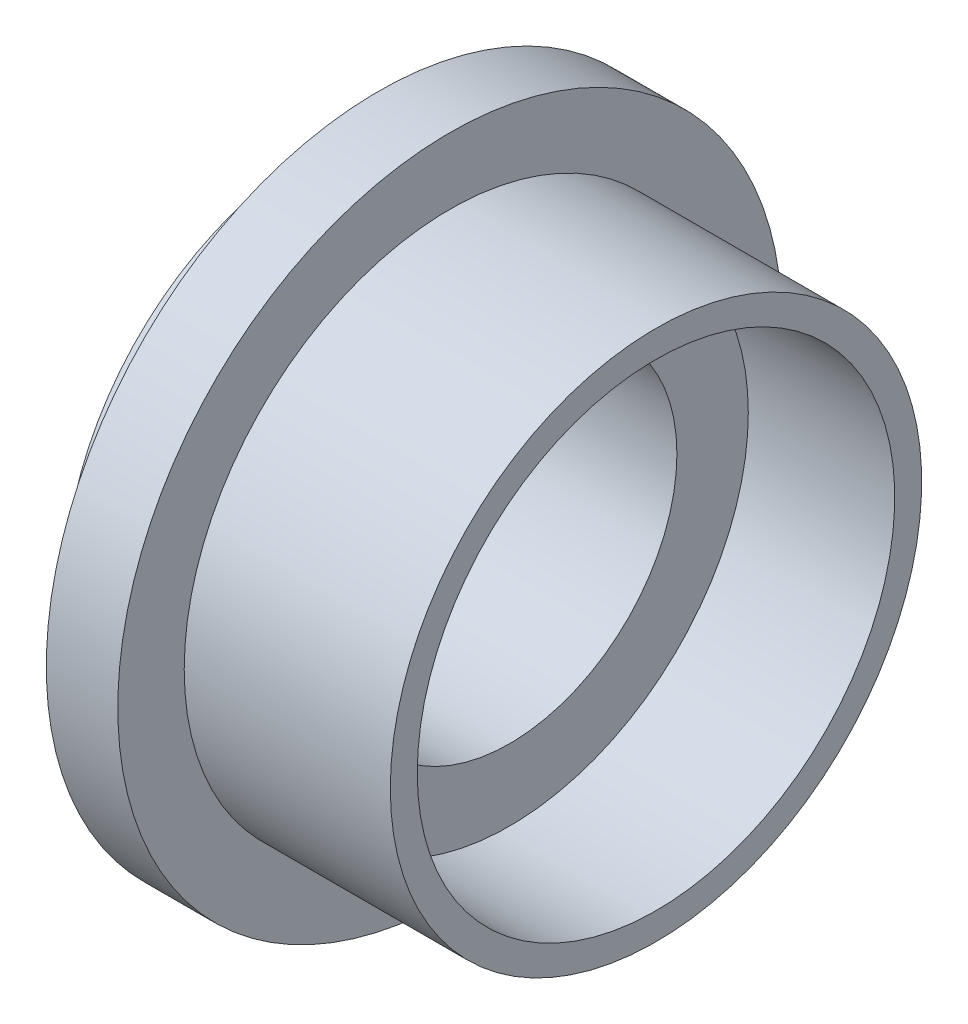
ISO-10303-21;
HEADER;
FILE_DESCRIPTION(('STEP AP214'),'2;1');
FILE_NAME('part.step','',(''),(''),'','','');
FILE_SCHEMA(('AUTOMOTIVE_DESIGN { 1 0 10303 214 1 1 1 1 }'));
ENDSEC;
DATA;
#1=APPLICATION_CONTEXT('core data for automotive mechanical design processes');
#2=APPLICATION_PROTOCOL_DEFINITION('international standard','automotive_design',2000,#1);
#3=PRODUCT_CONTEXT('',#1,'mechanical');
#4=PRODUCT('Part','Part','',(#3));
#5=PRODUCT_RELATED_PRODUCT_CATEGORY('part','',(#4));
#6=PRODUCT_DEFINITION_FORMATION('','',#4);
#7=PRODUCT_DEFINITION_CONTEXT('part definition',#1,'design');
#8=PRODUCT_DEFINITION('design','',#6,#7);
#9=PRODUCT_DEFINITION_SHAPE('','',#8);
#10=(LENGTH_UNIT() NAMED_UNIT(*) SI_UNIT(.MILLI.,.METRE.));
#11=(NAMED_UNIT(*) PLANE_ANGLE_UNIT() SI_UNIT($,.RADIAN.));
#12=(NAMED_UNIT(*) SI_UNIT($,.STERADIAN.) SOLID_ANGLE_UNIT());
#13=UNCERTAINTY_MEASURE_WITH_UNIT(LENGTH_MEASURE(1.E-05),#10,'distance_accuracy_value','');
#14=(GEOMETRIC_REPRESENTATION_CONTEXT(3) GLOBAL_UNCERTAINTY_ASSIGNED_CONTEXT((#13)) GLOBAL_UNIT_ASSIGNED_CONTEXT((#10,
#11,#12)) REPRESENTATION_CONTEXT('',''));
#15=CARTESIAN_POINT('',(0.,0.,0.));
#16=DIRECTION('',(0.,0.,1.));
#17=DIRECTION('',(1.,0.,0.));
#18=AXIS2_PLACEMENT_3D('',#15,#16,#17);
#19=CARTESIAN_POINT('',(-6.35,11.412,0.));
#20=DIRECTION('',(1.,0.,0.));
#21=DIRECTION('',(0.,0.,-1.));
#22=AXIS2_PLACEMENT_3D('',#19,#20,#21);
#23=PLANE('',#22);
#24=CARTESIAN_POINT('',(-6.35,0.,0.));
#25=DIRECTION('',(1.,0.,0.));
#26=DIRECTION('',(0.,0.,-1.));
#27=AXIS2_PLACEMENT_3D('',#24,#25,#26);
#28=CIRCLE('',#27,15.875);
#29=CARTESIAN_POINT('',(-6.35,0.,-15.875));
#30=VERTEX_POINT('',#29);
#31=EDGE_CURVE('E51',#30,#30,#28,.T.);
#32=ORIENTED_EDGE('',*,*,#31,.T.);
#33=EDGE_LOOP('',(#32));
#34=FACE_BOUND('',#33,.T.);
#35=CARTESIAN_POINT('',(-6.35,0.,0.));
#36=DIRECTION('',(1.,0.,0.));
#37=DIRECTION('',(0.,0.,-1.));
#38=AXIS2_PLACEMENT_3D('',#35,#36,#37);
#39=CIRCLE('',#38,12.7);
#40=CARTESIAN_POINT('',(-6.35,0.,-12.7));
#41=VERTEX_POINT('',#40);
#42=EDGE_CURVE('E63',#41,#41,#39,.T.);
#43=ORIENTED_EDGE('',*,*,#42,.F.);
#44=EDGE_LOOP('',(#43));
#45=FACE_BOUND('',#44,.T.);
#46=ADVANCED_FACE('F31',(#34,#45),#23,.T.);
#47=CARTESIAN_POINT('',(0.,0.,0.));
#48=DIRECTION('',(1.,0.,0.));
#49=DIRECTION('',(0.,0.,-1.));
#50=AXIS2_PLACEMENT_3D('',#47,#48,#49);
#51=CYLINDRICAL_SURFACE('',#50,8.);
#52=CARTESIAN_POINT('',(-3.5,0.,0.));
#53=DIRECTION('',(1.,0.,0.));
#54=DIRECTION('',(0.,0.,-1.));
#55=AXIS2_PLACEMENT_3D('',#52,#53,#54);
#56=CIRCLE('',#55,8.);
#57=CARTESIAN_POINT('',(-3.5,0.,-8.));
#58=VERTEX_POINT('',#57);
#59=EDGE_CURVE('E54',#58,#58,#56,.T.);
#60=ORIENTED_EDGE('',*,*,#59,.T.);
#61=EDGE_LOOP('',(#60));
#62=FACE_BOUND('',#61,.T.);
#63=CARTESIAN_POINT('',(-12.7,0.,0.));
#64=DIRECTION('',(1.,0.,0.));
#65=DIRECTION('',(0.,0.,-1.));
#66=AXIS2_PLACEMENT_3D('',#63,#64,#65);
#67=CIRCLE('',#66,8.);
#68=CARTESIAN_POINT('',(-12.7,0.,-8.));
#69=VERTEX_POINT('',#68);
#70=EDGE_CURVE('E10',#69,#69,#67,.T.);
#71=ORIENTED_EDGE('',*,*,#70,.F.);
#72=EDGE_LOOP('',(#71));
#73=FACE_BOUND('',#72,.T.);
#74=ADVANCED_FACE('F33',(#62,#73),#51,.F.);
#75=CARTESIAN_POINT('',(-12.7,12.065,0.));
#76=DIRECTION('',(-1.,0.,0.));
#77=DIRECTION('',(0.,0.,1.));
#78=AXIS2_PLACEMENT_3D('',#75,#76,#77);
#79=PLANE('',#78);
#80=ORIENTED_EDGE('',*,*,#70,.T.);
#81=EDGE_LOOP('',(#80));
#82=FACE_BOUND('',#81,.T.);
#83=CARTESIAN_POINT('',(-12.7,0.,0.));
#84=DIRECTION('',(1.,0.,0.));
#85=DIRECTION('',(0.,0.,-1.));
#86=AXIS2_PLACEMENT_3D('',#83,#84,#85);
#87=CIRCLE('',#86,12.065);
#88=CARTESIAN_POINT('',(-12.7,0.,-12.065));
#89=VERTEX_POINT('',#88);
#90=EDGE_CURVE('E38',#89,#89,#87,.T.);
#91=ORIENTED_EDGE('',*,*,#90,.F.);
#92=EDGE_LOOP('',(#91));
#93=FACE_BOUND('',#92,.T.);
#94=ADVANCED_FACE('F78',(#82,#93),#79,.T.);
#95=CARTESIAN_POINT('',(-12.7,0.,0.));
#96=DIRECTION('',(1.,0.,0.));
#97=DIRECTION('',(0.,0.,-1.));
#98=AXIS2_PLACEMENT_3D('',#95,#96,#97);
#99=TOROIDAL_SURFACE('',#98,13.335,1.27);
#100=ORIENTED_EDGE('',*,*,#90,.T.);
#101=EDGE_LOOP('',(#100));
#102=FACE_BOUND('',#101,.T.);
#103=CARTESIAN_POINT('',(-11.6001477371938,0.,0.));
#104=DIRECTION('',(1.,0.,0.));
#105=DIRECTION('',(0.,0.,-1.));
#106=AXIS2_PLACEMENT_3D('',#103,#104,#105);
#107=CIRCLE('',#106,12.7);
#108=CARTESIAN_POINT('',(-11.6001477371938,0.,-12.7));
#109=VERTEX_POINT('',#108);
#110=EDGE_CURVE('E42',#109,#109,#107,.T.);
#111=ORIENTED_EDGE('',*,*,#110,.F.);
#112=EDGE_LOOP('',(#111));
#113=FACE_BOUND('',#112,.T.);
#114=ADVANCED_FACE('F91',(#102,#113),#99,.F.);
#115=CARTESIAN_POINT('',(-9.76706063251671,0.,0.));
#116=DIRECTION('',(1.,0.,0.));
#117=DIRECTION('',(0.,0.,-1.));
#118=AXIS2_PLACEMENT_3D('',#115,#116,#117);
#119=CONICAL_SURFACE('',#118,15.875,1.0471975511966);
#120=ORIENTED_EDGE('',*,*,#110,.T.);
#121=EDGE_LOOP('',(#120));
#122=FACE_BOUND('',#121,.T.);
#123=CARTESIAN_POINT('',(-9.76706063251671,0.,0.));
#124=DIRECTION('',(1.,0.,0.));
#125=DIRECTION('',(0.,0.,-1.));
#126=AXIS2_PLACEMENT_3D('',#123,#124,#125);
#127=CIRCLE('',#126,15.875);
#128=CARTESIAN_POINT('',(-9.76706063251671,0.,-15.875));
#129=VERTEX_POINT('',#128);
#130=EDGE_CURVE('E46',#129,#129,#127,.T.);
#131=ORIENTED_EDGE('',*,*,#130,.F.);
#132=EDGE_LOOP('',(#131));
#133=FACE_BOUND('',#132,.T.);
#134=ADVANCED_FACE('F87',(#122,#133),#119,.T.);
#135=CARTESIAN_POINT('',(0.,0.,0.));
#136=DIRECTION('',(1.,0.,0.));
#137=DIRECTION('',(0.,0.,-1.));
#138=AXIS2_PLACEMENT_3D('',#135,#136,#137);
#139=CYLINDRICAL_SURFACE('',#138,15.875);
#140=ORIENTED_EDGE('',*,*,#130,.T.);
#141=EDGE_LOOP('',(#140));
#142=FACE_BOUND('',#141,.T.);
#143=ORIENTED_EDGE('',*,*,#31,.F.);
#144=EDGE_LOOP('',(#143));
#145=FACE_BOUND('',#144,.T.);
#146=ADVANCED_FACE('F84',(#142,#145),#139,.T.);
#147=CARTESIAN_POINT('',(-3.5,8.,0.));
#148=DIRECTION('',(1.,0.,0.));
#149=DIRECTION('',(0.,0.,-1.));
#150=AXIS2_PLACEMENT_3D('',#147,#148,#149);
#151=PLANE('',#150);
#152=CARTESIAN_POINT('',(-3.5,0.,0.));
#153=DIRECTION('',(1.,0.,0.));
#154=DIRECTION('',(0.,0.,-1.));
#155=AXIS2_PLACEMENT_3D('',#152,#153,#154);
#156=CIRCLE('',#155,11.412);
#157=CARTESIAN_POINT('',(-3.5,0.,-11.412));
#158=VERTEX_POINT('',#157);
#159=EDGE_CURVE('E57',#158,#158,#156,.F.);
#160=ORIENTED_EDGE('',*,*,#159,.F.);
#161=EDGE_LOOP('',(#160));
#162=FACE_BOUND('',#161,.T.);
#163=ORIENTED_EDGE('',*,*,#59,.F.);
#164=EDGE_LOOP('',(#163));
#165=FACE_BOUND('',#164,.T.);
#166=ADVANCED_FACE('F82',(#162,#165),#151,.T.);
#167=CARTESIAN_POINT('',(39.4210244842766,0.,0.));
#168=DIRECTION('',(-1.,0.,0.));
#169=DIRECTION('',(0.,0.,1.));
#170=AXIS2_PLACEMENT_3D('',#167,#168,#169);
#171=CYLINDRICAL_SURFACE('',#170,12.7);
#172=CARTESIAN_POINT('',(3.5,0.,0.));
#173=DIRECTION('',(-1.,0.,0.));
#174=DIRECTION('',(0.,0.,1.));
#175=AXIS2_PLACEMENT_3D('',#172,#173,#174);
#176=CIRCLE('',#175,12.7);
#177=CARTESIAN_POINT('',(3.5,0.,12.7));
#178=VERTEX_POINT('',#177);
#179=EDGE_CURVE('E64',#178,#178,#176,.T.);
#180=ORIENTED_EDGE('',*,*,#179,.T.);
#181=EDGE_LOOP('',(#180));
#182=FACE_BOUND('',#181,.T.);
#183=ORIENTED_EDGE('',*,*,#42,.T.);
#184=EDGE_LOOP('',(#183));
#185=FACE_BOUND('',#184,.T.);
#186=ADVANCED_FACE('F70',(#182,#185),#171,.T.);
#187=CARTESIAN_POINT('',(39.4210244842766,0.,0.));
#188=DIRECTION('',(-1.,0.,0.));
#189=DIRECTION('',(0.,0.,1.));
#190=AXIS2_PLACEMENT_3D('',#187,#188,#189);
#191=CYLINDRICAL_SURFACE('',#190,11.412);
#192=ORIENTED_EDGE('',*,*,#159,.T.);
#193=EDGE_LOOP('',(#192));
#194=FACE_BOUND('',#193,.T.);
#195=CARTESIAN_POINT('',(3.5,0.,0.));
#196=DIRECTION('',(-1.,0.,0.));
#197=DIRECTION('',(0.,0.,1.));
#198=AXIS2_PLACEMENT_3D('',#195,#196,#197);
#199=CIRCLE('',#198,11.412);
#200=CARTESIAN_POINT('',(3.5,0.,11.412));
#201=VERTEX_POINT('',#200);
#202=EDGE_CURVE('E60',#201,#201,#199,.T.);
#203=ORIENTED_EDGE('',*,*,#202,.F.);
#204=EDGE_LOOP('',(#203));
#205=FACE_BOUND('',#204,.T.);
#206=ADVANCED_FACE('F124',(#194,#205),#191,.F.);
#207=CARTESIAN_POINT('',(3.5,11.412,0.));
#208=DIRECTION('',(-1.,0.,0.));
#209=DIRECTION('',(0.,0.,1.));
#210=AXIS2_PLACEMENT_3D('',#207,#208,#209);
#211=PLANE('',#210);
#212=ORIENTED_EDGE('',*,*,#202,.T.);
#213=EDGE_LOOP('',(#212));
#214=FACE_BOUND('',#213,.T.);
#215=ORIENTED_EDGE('',*,*,#179,.F.);
#216=EDGE_LOOP('',(#215));
#217=FACE_BOUND('',#216,.T.);
#218=ADVANCED_FACE('F132',(#214,#217),#211,.F.);
#219=CLOSED_SHELL('',(#46,#74,#94,#114,#134,#146,#166,#186,#206,#218));
#220=MANIFOLD_SOLID_BREP('B2',#219);
#221=ADVANCED_BREP_SHAPE_REPRESENTATION('',(#18,#220),#14);
#222=SHAPE_DEFINITION_REPRESENTATION(#9,#221);
ENDSEC;
END-ISO-10303-21;
